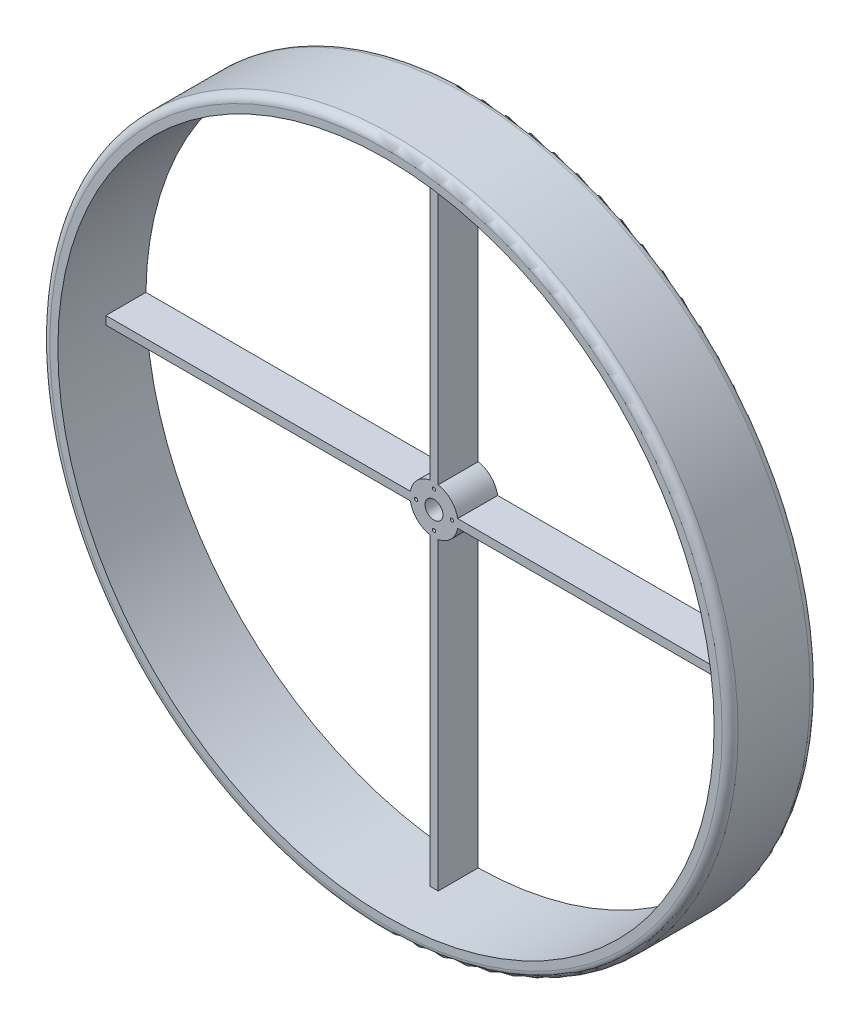
ISO-10303-21;
HEADER;
FILE_DESCRIPTION(('STEP AP214'),'2;1');
FILE_NAME('part.step','',(''),(''),'','','');
FILE_SCHEMA(('AUTOMOTIVE_DESIGN { 1 0 10303 214 1 1 1 1 }'));
ENDSEC;
DATA;
#1=APPLICATION_CONTEXT('core data for automotive mechanical design processes');
#2=APPLICATION_PROTOCOL_DEFINITION('international standard','automotive_design',2000,#1);
#3=PRODUCT_CONTEXT('',#1,'mechanical');
#4=PRODUCT('Part','Part','',(#3));
#5=PRODUCT_RELATED_PRODUCT_CATEGORY('part','',(#4));
#6=PRODUCT_DEFINITION_FORMATION('','',#4);
#7=PRODUCT_DEFINITION_CONTEXT('part definition',#1,'design');
#8=PRODUCT_DEFINITION('design','',#6,#7);
#9=PRODUCT_DEFINITION_SHAPE('','',#8);
#10=(LENGTH_UNIT() NAMED_UNIT(*) SI_UNIT(.MILLI.,.METRE.));
#11=(NAMED_UNIT(*) PLANE_ANGLE_UNIT() SI_UNIT($,.RADIAN.));
#12=(NAMED_UNIT(*) SI_UNIT($,.STERADIAN.) SOLID_ANGLE_UNIT());
#13=UNCERTAINTY_MEASURE_WITH_UNIT(LENGTH_MEASURE(1.E-05),#10,'distance_accuracy_value','');
#14=(GEOMETRIC_REPRESENTATION_CONTEXT(3) GLOBAL_UNCERTAINTY_ASSIGNED_CONTEXT((#13)) GLOBAL_UNIT_ASSIGNED_CONTEXT((#10,
#11,#12)) REPRESENTATION_CONTEXT('',''));
#15=CARTESIAN_POINT('',(0.,0.,0.));
#16=DIRECTION('',(0.,0.,1.));
#17=DIRECTION('',(1.,0.,0.));
#18=AXIS2_PLACEMENT_3D('',#15,#16,#17);
#19=CARTESIAN_POINT('',(0.,0.,-3.125));
#20=DIRECTION('',(0.,0.,1.));
#21=DIRECTION('',(1.,0.,0.));
#22=AXIS2_PLACEMENT_3D('',#19,#20,#21);
#23=CYLINDRICAL_SURFACE('',#22,128.125);
#24=CARTESIAN_POINT('',(0.,0.,31.25));
#25=DIRECTION('',(0.,0.,1.));
#26=DIRECTION('',(1.,0.,0.));
#27=AXIS2_PLACEMENT_3D('',#24,#25,#26);
#28=CIRCLE('',#27,128.125);
#29=CARTESIAN_POINT('',(128.125,0.,31.25));
#30=VERTEX_POINT('',#29);
#31=EDGE_CURVE('E290',#30,#30,#28,.T.);
#32=ORIENTED_EDGE('',*,*,#31,.T.);
#33=EDGE_LOOP('',(#32));
#34=FACE_BOUND('',#33,.T.);
#35=DIRECTION('',(0.,0.,1.));
#36=VECTOR('',#35,1.);
#37=CARTESIAN_POINT('',(1.62795166562606,-128.114657234738,-3.125));
#38=LINE('',#37,#36);
#39=CARTESIAN_POINT('',(1.62795166562606,-128.114657234738,12.5));
#40=VERTEX_POINT('',#39);
#41=CARTESIAN_POINT('',(1.62795166562606,-128.114657234738,-3.125));
#42=VERTEX_POINT('',#41);
#43=EDGE_CURVE('E347',#40,#42,#38,.F.);
#44=ORIENTED_EDGE('',*,*,#43,.F.);
#45=CARTESIAN_POINT('',(0.,0.,12.5));
#46=DIRECTION('',(0.,0.,1.));
#47=DIRECTION('',(1.,0.,0.));
#48=AXIS2_PLACEMENT_3D('',#45,#46,#47);
#49=CIRCLE('',#48,128.125);
#50=CARTESIAN_POINT('',(-1.62795166562874,-128.114657234738,12.5));
#51=VERTEX_POINT('',#50);
#52=EDGE_CURVE('E320',#40,#51,#49,.F.);
#53=ORIENTED_EDGE('',*,*,#52,.T.);
#54=DIRECTION('',(0.,0.,1.));
#55=VECTOR('',#54,1.);
#56=CARTESIAN_POINT('',(-1.62795166562874,-128.114657234738,-3.125));
#57=LINE('',#56,#55);
#58=CARTESIAN_POINT('',(-1.62795166562874,-128.114657234738,-3.125));
#59=VERTEX_POINT('',#58);
#60=EDGE_CURVE('E343',#51,#59,#57,.F.);
#61=ORIENTED_EDGE('',*,*,#60,.T.);
#62=CARTESIAN_POINT('',(0.,0.,-3.125));
#63=DIRECTION('',(0.,0.,1.));
#64=DIRECTION('',(1.,0.,0.));
#65=AXIS2_PLACEMENT_3D('',#62,#63,#64);
#66=CIRCLE('',#65,128.125);
#67=CARTESIAN_POINT('',(-128.114657234738,-1.62795166562741,-3.125));
#68=VERTEX_POINT('',#67);
#69=EDGE_CURVE('E657',#68,#59,#66,.T.);
#70=ORIENTED_EDGE('',*,*,#69,.F.);
#71=DIRECTION('',(0.,0.,1.));
#72=VECTOR('',#71,1.);
#73=CARTESIAN_POINT('',(-128.114657234738,-1.62795166562741,-3.125));
#74=LINE('',#73,#72);
#75=CARTESIAN_POINT('',(-128.114657234738,-1.62795166562741,12.5));
#76=VERTEX_POINT('',#75);
#77=EDGE_CURVE('E340',#76,#68,#74,.F.);
#78=ORIENTED_EDGE('',*,*,#77,.F.);
#79=CARTESIAN_POINT('',(-128.114657234738,1.62795166562741,12.5));
#80=VERTEX_POINT('',#79);
#81=EDGE_CURVE('E335',#76,#80,#49,.F.);
#82=ORIENTED_EDGE('',*,*,#81,.T.);
#83=DIRECTION('',(0.,0.,1.));
#84=VECTOR('',#83,1.);
#85=CARTESIAN_POINT('',(-128.114657234738,1.62795166562741,-3.125));
#86=LINE('',#85,#84);
#87=CARTESIAN_POINT('',(-128.114657234738,1.62795166562741,-3.125));
#88=VERTEX_POINT('',#87);
#89=EDGE_CURVE('E336',#80,#88,#86,.F.);
#90=ORIENTED_EDGE('',*,*,#89,.T.);
#91=CARTESIAN_POINT('',(-1.62795166562606,128.114657234738,-3.125));
#92=VERTEX_POINT('',#91);
#93=EDGE_CURVE('E316',#92,#88,#66,.T.);
#94=ORIENTED_EDGE('',*,*,#93,.F.);
#95=DIRECTION('',(0.,0.,1.));
#96=VECTOR('',#95,1.);
#97=CARTESIAN_POINT('',(-1.62795166562606,128.114657234738,-3.125));
#98=LINE('',#97,#96);
#99=CARTESIAN_POINT('',(-1.62795166562606,128.114657234738,12.5));
#100=VERTEX_POINT('',#99);
#101=EDGE_CURVE('E332',#100,#92,#98,.F.);
#102=ORIENTED_EDGE('',*,*,#101,.F.);
#103=CARTESIAN_POINT('',(1.62795166562876,128.114657234738,12.5));
#104=VERTEX_POINT('',#103);
#105=EDGE_CURVE('E321',#100,#104,#49,.F.);
#106=ORIENTED_EDGE('',*,*,#105,.T.);
#107=DIRECTION('',(0.,0.,1.));
#108=VECTOR('',#107,1.);
#109=CARTESIAN_POINT('',(1.62795166562876,128.114657234738,-3.125));
#110=LINE('',#109,#108);
#111=CARTESIAN_POINT('',(1.62795166562876,128.114657234738,-3.125));
#112=VERTEX_POINT('',#111);
#113=EDGE_CURVE('E328',#104,#112,#110,.F.);
#114=ORIENTED_EDGE('',*,*,#113,.T.);
#115=CARTESIAN_POINT('',(128.114657234738,1.62795166562741,-3.125));
#116=VERTEX_POINT('',#115);
#117=EDGE_CURVE('E312',#116,#112,#66,.T.);
#118=ORIENTED_EDGE('',*,*,#117,.F.);
#119=DIRECTION('',(0.,0.,1.));
#120=VECTOR('',#119,1.);
#121=CARTESIAN_POINT('',(128.114657234738,1.62795166562741,-3.125));
#122=LINE('',#121,#120);
#123=CARTESIAN_POINT('',(128.114657234738,1.62795166562741,12.5));
#124=VERTEX_POINT('',#123);
#125=EDGE_CURVE('E325',#124,#116,#122,.F.);
#126=ORIENTED_EDGE('',*,*,#125,.F.);
#127=CARTESIAN_POINT('',(128.114657234738,-1.62795166562741,12.5));
#128=VERTEX_POINT('',#127);
#129=EDGE_CURVE('E182',#124,#128,#49,.F.);
#130=ORIENTED_EDGE('',*,*,#129,.T.);
#131=DIRECTION('',(0.,0.,1.));
#132=VECTOR('',#131,1.);
#133=CARTESIAN_POINT('',(128.114657234738,-1.62795166562741,-3.125));
#134=LINE('',#133,#132);
#135=CARTESIAN_POINT('',(128.114657234738,-1.62795166562741,-3.125));
#136=VERTEX_POINT('',#135);
#137=EDGE_CURVE('E319',#128,#136,#134,.F.);
#138=ORIENTED_EDGE('',*,*,#137,.T.);
#139=EDGE_CURVE('E311',#42,#136,#66,.T.);
#140=ORIENTED_EDGE('',*,*,#139,.F.);
#141=EDGE_LOOP('',(#44,#53,#61,#70,#78,#82,#90,#94,#102,#106,#114,#118,#126,#130,#138,#140));
#142=FACE_BOUND('',#141,.T.);
#143=ADVANCED_FACE('F43',(#34,#142),#23,.F.);
#144=CARTESIAN_POINT('',(0.,0.,-3.125));
#145=DIRECTION('',(0.,0.,1.));
#146=DIRECTION('',(1.,0.,0.));
#147=AXIS2_PLACEMENT_3D('',#144,#145,#146);
#148=CYLINDRICAL_SURFACE('',#147,134.375);
#149=CARTESIAN_POINT('',(0.,0.,0.));
#150=DIRECTION('',(0.,0.,1.));
#151=DIRECTION('',(1.,0.,0.));
#152=AXIS2_PLACEMENT_3D('',#149,#150,#151);
#153=CIRCLE('',#152,134.375);
#154=CARTESIAN_POINT('',(134.375,0.,0.));
#155=VERTEX_POINT('',#154);
#156=EDGE_CURVE('E52',#155,#155,#153,.T.);
#157=ORIENTED_EDGE('',*,*,#156,.T.);
#158=EDGE_LOOP('',(#157));
#159=FACE_BOUND('',#158,.T.);
#160=CARTESIAN_POINT('',(0.,0.,28.125));
#161=DIRECTION('',(0.,0.,1.));
#162=DIRECTION('',(1.,0.,0.));
#163=AXIS2_PLACEMENT_3D('',#160,#161,#162);
#164=CIRCLE('',#163,134.375);
#165=CARTESIAN_POINT('',(134.375,0.,28.125));
#166=VERTEX_POINT('',#165);
#167=EDGE_CURVE('E354',#166,#166,#164,.F.);
#168=ORIENTED_EDGE('',*,*,#167,.T.);
#169=EDGE_LOOP('',(#168));
#170=FACE_BOUND('',#169,.T.);
#171=ADVANCED_FACE('F361',(#159,#170),#148,.T.);
#172=CARTESIAN_POINT('',(0.,0.,-3.125));
#173=DIRECTION('',(0.,0.,1.));
#174=DIRECTION('',(1.,0.,0.));
#175=AXIS2_PLACEMENT_3D('',#172,#173,#174);
#176=PLANE('',#175);
#177=CARTESIAN_POINT('',(0.,0.,-3.125));
#178=DIRECTION('',(0.,0.,1.));
#179=DIRECTION('',(1.,0.,0.));
#180=AXIS2_PLACEMENT_3D('',#177,#178,#179);
#181=CIRCLE('',#180,131.25);
#182=CARTESIAN_POINT('',(131.25,0.,-3.125));
#183=VERTEX_POINT('',#182);
#184=EDGE_CURVE('E11',#183,#183,#181,.F.);
#185=ORIENTED_EDGE('',*,*,#184,.T.);
#186=EDGE_LOOP('',(#185));
#187=FACE_BOUND('',#186,.T.);
#188=DIRECTION('',(1.,0.,0.));
#189=VECTOR('',#188,1.);
#190=CARTESIAN_POINT('',(0.,1.62795166562741,-3.125));
#191=LINE('',#190,#189);
#192=CARTESIAN_POINT('',(9.23257268448946,1.62795166562741,-3.125));
#193=VERTEX_POINT('',#192);
#194=EDGE_CURVE('E165',#193,#116,#191,.T.);
#195=ORIENTED_EDGE('',*,*,#194,.T.);
#196=ORIENTED_EDGE('',*,*,#117,.T.);
#197=DIRECTION('',(0.,1.,0.));
#198=VECTOR('',#197,1.);
#199=CARTESIAN_POINT('',(1.62795166562741,0.,-3.125));
#200=LINE('',#199,#198);
#201=CARTESIAN_POINT('',(1.6279516656275,9.23257268448945,-3.125));
#202=VERTEX_POINT('',#201);
#203=EDGE_CURVE('E248',#202,#112,#200,.T.);
#204=ORIENTED_EDGE('',*,*,#203,.F.);
#205=CARTESIAN_POINT('',(0.,0.,-3.125));
#206=DIRECTION('',(0.,0.,1.));
#207=DIRECTION('',(1.,0.,0.));
#208=AXIS2_PLACEMENT_3D('',#205,#206,#207);
#209=CIRCLE('',#208,9.375);
#210=EDGE_CURVE('E245',#193,#202,#209,.T.);
#211=ORIENTED_EDGE('',*,*,#210,.F.);
#212=EDGE_LOOP('',(#195,#196,#204,#211));
#213=FACE_BOUND('',#212,.T.);
#214=DIRECTION('',(0.,-1.,0.));
#215=VECTOR('',#214,1.);
#216=CARTESIAN_POINT('',(1.62795166562741,0.,-3.125));
#217=LINE('',#216,#215);
#218=CARTESIAN_POINT('',(1.62795166562731,-9.23257268448948,-3.125));
#219=VERTEX_POINT('',#218);
#220=EDGE_CURVE('E273',#219,#42,#217,.T.);
#221=ORIENTED_EDGE('',*,*,#220,.T.);
#222=ORIENTED_EDGE('',*,*,#139,.T.);
#223=DIRECTION('',(1.,0.,0.));
#224=VECTOR('',#223,1.);
#225=CARTESIAN_POINT('',(0.,-1.62795166562741,-3.125));
#226=LINE('',#225,#224);
#227=CARTESIAN_POINT('',(9.23257268448946,-1.62795166562741,-3.125));
#228=VERTEX_POINT('',#227);
#229=EDGE_CURVE('E281',#228,#136,#226,.T.);
#230=ORIENTED_EDGE('',*,*,#229,.F.);
#231=CARTESIAN_POINT('',(0.,0.,-3.125));
#232=DIRECTION('',(0.,0.,1.));
#233=DIRECTION('',(1.,0.,0.));
#234=AXIS2_PLACEMENT_3D('',#231,#232,#233);
#235=CIRCLE('',#234,9.375);
#236=EDGE_CURVE('E277',#219,#228,#235,.T.);
#237=ORIENTED_EDGE('',*,*,#236,.F.);
#238=EDGE_LOOP('',(#221,#222,#230,#237));
#239=FACE_BOUND('',#238,.T.);
#240=DIRECTION('',(-1.,0.,0.));
#241=VECTOR('',#240,1.);
#242=CARTESIAN_POINT('',(0.,-1.62795166562741,-3.125));
#243=LINE('',#242,#241);
#244=CARTESIAN_POINT('',(-9.23257268448946,-1.62795166562741,-3.125));
#245=VERTEX_POINT('',#244);
#246=EDGE_CURVE('E262',#245,#68,#243,.T.);
#247=ORIENTED_EDGE('',*,*,#246,.T.);
#248=ORIENTED_EDGE('',*,*,#69,.T.);
#249=DIRECTION('',(0.,-1.,0.));
#250=VECTOR('',#249,1.);
#251=CARTESIAN_POINT('',(-1.62795166562741,0.,-3.125));
#252=LINE('',#251,#250);
#253=CARTESIAN_POINT('',(-1.6279516656275,-9.23257268448945,-3.125));
#254=VERTEX_POINT('',#253);
#255=EDGE_CURVE('E270',#254,#59,#252,.T.);
#256=ORIENTED_EDGE('',*,*,#255,.F.);
#257=CARTESIAN_POINT('',(0.,0.,-3.125));
#258=DIRECTION('',(0.,0.,1.));
#259=DIRECTION('',(1.,0.,0.));
#260=AXIS2_PLACEMENT_3D('',#257,#258,#259);
#261=CIRCLE('',#260,9.375);
#262=EDGE_CURVE('E266',#245,#254,#261,.T.);
#263=ORIENTED_EDGE('',*,*,#262,.F.);
#264=EDGE_LOOP('',(#247,#248,#256,#263));
#265=FACE_BOUND('',#264,.T.);
#266=DIRECTION('',(0.,1.,0.));
#267=VECTOR('',#266,1.);
#268=CARTESIAN_POINT('',(-1.62795166562741,0.,-3.125));
#269=LINE('',#268,#267);
#270=CARTESIAN_POINT('',(-1.62795166562731,9.23257268448948,-3.125));
#271=VERTEX_POINT('',#270);
#272=EDGE_CURVE('E251',#271,#92,#269,.T.);
#273=ORIENTED_EDGE('',*,*,#272,.T.);
#274=ORIENTED_EDGE('',*,*,#93,.T.);
#275=DIRECTION('',(-1.,0.,0.));
#276=VECTOR('',#275,1.);
#277=CARTESIAN_POINT('',(0.,1.62795166562741,-3.125));
#278=LINE('',#277,#276);
#279=CARTESIAN_POINT('',(-9.23257268448946,1.62795166562741,-3.125));
#280=VERTEX_POINT('',#279);
#281=EDGE_CURVE('E259',#280,#88,#278,.T.);
#282=ORIENTED_EDGE('',*,*,#281,.F.);
#283=CARTESIAN_POINT('',(0.,0.,-3.125));
#284=DIRECTION('',(0.,0.,1.));
#285=DIRECTION('',(1.,0.,0.));
#286=AXIS2_PLACEMENT_3D('',#283,#284,#285);
#287=CIRCLE('',#286,9.375);
#288=EDGE_CURVE('E255',#271,#280,#287,.T.);
#289=ORIENTED_EDGE('',*,*,#288,.F.);
#290=EDGE_LOOP('',(#273,#274,#282,#289));
#291=FACE_BOUND('',#290,.T.);
#292=CARTESIAN_POINT('',(0.,6.99999999999998,-3.125));
#293=DIRECTION('',(0.,0.,1.));
#294=DIRECTION('',(1.,0.,0.));
#295=AXIS2_PLACEMENT_3D('',#292,#293,#294);
#296=CIRCLE('',#295,0.624999999999999);
#297=CARTESIAN_POINT('',(0.625000000000073,6.99999999999998,-3.125));
#298=VERTEX_POINT('',#297);
#299=EDGE_CURVE('E227',#298,#298,#296,.T.);
#300=ORIENTED_EDGE('',*,*,#299,.T.);
#301=EDGE_LOOP('',(#300));
#302=FACE_BOUND('',#301,.T.);
#303=CARTESIAN_POINT('',(-6.99999999999998,0.,-3.125));
#304=DIRECTION('',(0.,0.,1.));
#305=DIRECTION('',(1.,0.,0.));
#306=AXIS2_PLACEMENT_3D('',#303,#304,#305);
#307=CIRCLE('',#306,0.625);
#308=CARTESIAN_POINT('',(-6.37499999999998,0.,-3.125));
#309=VERTEX_POINT('',#308);
#310=EDGE_CURVE('E231',#309,#309,#307,.F.);
#311=ORIENTED_EDGE('',*,*,#310,.F.);
#312=EDGE_LOOP('',(#311));
#313=FACE_BOUND('',#312,.T.);
#314=CARTESIAN_POINT('',(7.,0.,-3.125));
#315=DIRECTION('',(0.,0.,1.));
#316=DIRECTION('',(1.,0.,0.));
#317=AXIS2_PLACEMENT_3D('',#314,#315,#316);
#318=CIRCLE('',#317,0.625);
#319=CARTESIAN_POINT('',(7.625,0.,-3.125));
#320=VERTEX_POINT('',#319);
#321=EDGE_CURVE('E235',#320,#320,#318,.T.);
#322=ORIENTED_EDGE('',*,*,#321,.T.);
#323=EDGE_LOOP('',(#322));
#324=FACE_BOUND('',#323,.T.);
#325=CARTESIAN_POINT('',(0.,0.,-3.125));
#326=DIRECTION('',(0.,0.,1.));
#327=DIRECTION('',(1.,0.,0.));
#328=AXIS2_PLACEMENT_3D('',#325,#326,#327);
#329=CIRCLE('',#328,3.5);
#330=CARTESIAN_POINT('',(3.5,0.,-3.125));
#331=VERTEX_POINT('',#330);
#332=EDGE_CURVE('E239',#331,#331,#329,.T.);
#333=ORIENTED_EDGE('',*,*,#332,.T.);
#334=EDGE_LOOP('',(#333));
#335=FACE_BOUND('',#334,.T.);
#336=CARTESIAN_POINT('',(0.,-7.,-3.125));
#337=DIRECTION('',(0.,0.,1.));
#338=DIRECTION('',(1.,0.,0.));
#339=AXIS2_PLACEMENT_3D('',#336,#337,#338);
#340=CIRCLE('',#339,0.625);
#341=CARTESIAN_POINT('',(0.624999999999929,-7.,-3.125));
#342=VERTEX_POINT('',#341);
#343=EDGE_CURVE('E171',#342,#342,#340,.F.);
#344=ORIENTED_EDGE('',*,*,#343,.F.);
#345=EDGE_LOOP('',(#344));
#346=FACE_BOUND('',#345,.T.);
#347=ADVANCED_FACE('F379',(#187,#213,#239,#265,#291,#302,#313,#324,#335,#346),#176,.F.);
#348=CARTESIAN_POINT('',(0.,0.,31.25));
#349=DIRECTION('',(0.,0.,1.));
#350=DIRECTION('',(1.,0.,0.));
#351=AXIS2_PLACEMENT_3D('',#348,#349,#350);
#352=PLANE('',#351);
#353=CARTESIAN_POINT('',(0.,0.,31.25));
#354=DIRECTION('',(0.,0.,1.));
#355=DIRECTION('',(1.,0.,0.));
#356=AXIS2_PLACEMENT_3D('',#353,#354,#355);
#357=CIRCLE('',#356,131.25);
#358=CARTESIAN_POINT('',(131.25,0.,31.25));
#359=VERTEX_POINT('',#358);
#360=EDGE_CURVE('E350',#359,#359,#357,.T.);
#361=ORIENTED_EDGE('',*,*,#360,.T.);
#362=EDGE_LOOP('',(#361));
#363=FACE_BOUND('',#362,.T.);
#364=ORIENTED_EDGE('',*,*,#31,.F.);
#365=EDGE_LOOP('',(#364));
#366=FACE_BOUND('',#365,.T.);
#367=ADVANCED_FACE('F384',(#363,#366),#352,.T.);
#368=CARTESIAN_POINT('',(0.,1.62795166562741,-3.125));
#369=DIRECTION('',(0.,-1.,0.));
#370=DIRECTION('',(0.,0.,-1.));
#371=AXIS2_PLACEMENT_3D('',#368,#369,#370);
#372=PLANE('',#371);
#373=DIRECTION('',(1.,0.,0.));
#374=VECTOR('',#373,1.);
#375=CARTESIAN_POINT('',(0.,1.62795166562741,12.5));
#376=LINE('',#375,#374);
#377=CARTESIAN_POINT('',(9.23257268448946,1.62795166562741,12.5));
#378=VERTEX_POINT('',#377);
#379=EDGE_CURVE('E162',#378,#124,#376,.T.);
#380=ORIENTED_EDGE('',*,*,#379,.T.);
#381=ORIENTED_EDGE('',*,*,#125,.T.);
#382=ORIENTED_EDGE('',*,*,#194,.F.);
#383=DIRECTION('',(0.,0.,1.));
#384=VECTOR('',#383,1.);
#385=CARTESIAN_POINT('',(9.23257268448946,1.62795166562741,-3.125));
#386=LINE('',#385,#384);
#387=EDGE_CURVE('E158',#193,#378,#386,.T.);
#388=ORIENTED_EDGE('',*,*,#387,.T.);
#389=EDGE_LOOP('',(#380,#381,#382,#388));
#390=FACE_BOUND('',#389,.T.);
#391=ADVANCED_FACE('F160',(#390),#372,.F.);
#392=CARTESIAN_POINT('',(0.,-1.62795166562741,-3.125));
#393=DIRECTION('',(0.,-1.,0.));
#394=DIRECTION('',(0.,0.,-1.));
#395=AXIS2_PLACEMENT_3D('',#392,#393,#394);
#396=PLANE('',#395);
#397=ORIENTED_EDGE('',*,*,#137,.F.);
#398=DIRECTION('',(1.,0.,0.));
#399=VECTOR('',#398,1.);
#400=CARTESIAN_POINT('',(0.,-1.62795166562741,12.5));
#401=LINE('',#400,#399);
#402=CARTESIAN_POINT('',(9.23257268448946,-1.62795166562741,12.5));
#403=VERTEX_POINT('',#402);
#404=EDGE_CURVE('E220',#403,#128,#401,.T.);
#405=ORIENTED_EDGE('',*,*,#404,.F.);
#406=DIRECTION('',(0.,0.,1.));
#407=VECTOR('',#406,1.);
#408=CARTESIAN_POINT('',(9.23257268448946,-1.62795166562741,-3.125));
#409=LINE('',#408,#407);
#410=EDGE_CURVE('E287',#228,#403,#409,.T.);
#411=ORIENTED_EDGE('',*,*,#410,.F.);
#412=ORIENTED_EDGE('',*,*,#229,.T.);
#413=EDGE_LOOP('',(#397,#405,#411,#412));
#414=FACE_BOUND('',#413,.T.);
#415=ADVANCED_FACE('F444',(#414),#396,.T.);
#416=CARTESIAN_POINT('',(1.62795166562741,0.,-3.125));
#417=DIRECTION('',(-1.,0.,0.));
#418=DIRECTION('',(0.,-1.,0.));
#419=AXIS2_PLACEMENT_3D('',#416,#417,#418);
#420=PLANE('',#419);
#421=DIRECTION('',(0.,-1.,0.));
#422=VECTOR('',#421,1.);
#423=CARTESIAN_POINT('',(1.62795166562741,0.,12.5));
#424=LINE('',#423,#422);
#425=CARTESIAN_POINT('',(1.62795166562731,-9.23257268448948,12.5));
#426=VERTEX_POINT('',#425);
#427=EDGE_CURVE('E212',#426,#40,#424,.T.);
#428=ORIENTED_EDGE('',*,*,#427,.T.);
#429=ORIENTED_EDGE('',*,*,#43,.T.);
#430=ORIENTED_EDGE('',*,*,#220,.F.);
#431=DIRECTION('',(0.,0.,1.));
#432=VECTOR('',#431,1.);
#433=CARTESIAN_POINT('',(1.62795166562731,-9.23257268448948,-3.125));
#434=LINE('',#433,#432);
#435=EDGE_CURVE('E291',#219,#426,#434,.T.);
#436=ORIENTED_EDGE('',*,*,#435,.T.);
#437=EDGE_LOOP('',(#428,#429,#430,#436));
#438=FACE_BOUND('',#437,.T.);
#439=ADVANCED_FACE('F446',(#438),#420,.F.);
#440=CARTESIAN_POINT('',(-1.62795166562741,0.,-3.125));
#441=DIRECTION('',(-1.,0.,0.));
#442=DIRECTION('',(0.,-1.,0.));
#443=AXIS2_PLACEMENT_3D('',#440,#441,#442);
#444=PLANE('',#443);
#445=ORIENTED_EDGE('',*,*,#60,.F.);
#446=DIRECTION('',(0.,-1.,0.));
#447=VECTOR('',#446,1.);
#448=CARTESIAN_POINT('',(-1.62795166562741,0.,12.5));
#449=LINE('',#448,#447);
#450=CARTESIAN_POINT('',(-1.6279516656275,-9.23257268448945,12.5));
#451=VERTEX_POINT('',#450);
#452=EDGE_CURVE('E59',#451,#51,#449,.T.);
#453=ORIENTED_EDGE('',*,*,#452,.F.);
#454=DIRECTION('',(0.,0.,1.));
#455=VECTOR('',#454,1.);
#456=CARTESIAN_POINT('',(-1.6279516656275,-9.23257268448945,-3.125));
#457=LINE('',#456,#455);
#458=EDGE_CURVE('E294',#254,#451,#457,.T.);
#459=ORIENTED_EDGE('',*,*,#458,.F.);
#460=ORIENTED_EDGE('',*,*,#255,.T.);
#461=EDGE_LOOP('',(#445,#453,#459,#460));
#462=FACE_BOUND('',#461,.T.);
#463=ADVANCED_FACE('F451',(#462),#444,.T.);
#464=CARTESIAN_POINT('',(0.,-1.62795166562741,-3.125));
#465=DIRECTION('',(0.,1.,0.));
#466=DIRECTION('',(0.,0.,1.));
#467=AXIS2_PLACEMENT_3D('',#464,#465,#466);
#468=PLANE('',#467);
#469=DIRECTION('',(-1.,0.,0.));
#470=VECTOR('',#469,1.);
#471=CARTESIAN_POINT('',(0.,-1.62795166562741,12.5));
#472=LINE('',#471,#470);
#473=CARTESIAN_POINT('',(-9.23257268448946,-1.62795166562741,12.5));
#474=VERTEX_POINT('',#473);
#475=EDGE_CURVE('E203',#474,#76,#472,.T.);
#476=ORIENTED_EDGE('',*,*,#475,.T.);
#477=ORIENTED_EDGE('',*,*,#77,.T.);
#478=ORIENTED_EDGE('',*,*,#246,.F.);
#479=DIRECTION('',(0.,0.,1.));
#480=VECTOR('',#479,1.);
#481=CARTESIAN_POINT('',(-9.23257268448946,-1.62795166562741,-3.125));
#482=LINE('',#481,#480);
#483=EDGE_CURVE('E297',#245,#474,#482,.T.);
#484=ORIENTED_EDGE('',*,*,#483,.T.);
#485=EDGE_LOOP('',(#476,#477,#478,#484));
#486=FACE_BOUND('',#485,.T.);
#487=ADVANCED_FACE('F455',(#486),#468,.F.);
#488=CARTESIAN_POINT('',(0.,1.62795166562741,-3.125));
#489=DIRECTION('',(0.,1.,0.));
#490=DIRECTION('',(0.,0.,1.));
#491=AXIS2_PLACEMENT_3D('',#488,#489,#490);
#492=PLANE('',#491);
#493=ORIENTED_EDGE('',*,*,#89,.F.);
#494=DIRECTION('',(-1.,0.,0.));
#495=VECTOR('',#494,1.);
#496=CARTESIAN_POINT('',(0.,1.62795166562741,12.5));
#497=LINE('',#496,#495);
#498=CARTESIAN_POINT('',(-9.23257268448946,1.62795166562741,12.5));
#499=VERTEX_POINT('',#498);
#500=EDGE_CURVE('E66',#499,#80,#497,.T.);
#501=ORIENTED_EDGE('',*,*,#500,.F.);
#502=DIRECTION('',(0.,0.,1.));
#503=VECTOR('',#502,1.);
#504=CARTESIAN_POINT('',(-9.23257268448946,1.62795166562741,-3.125));
#505=LINE('',#504,#503);
#506=EDGE_CURVE('E300',#280,#499,#505,.T.);
#507=ORIENTED_EDGE('',*,*,#506,.F.);
#508=ORIENTED_EDGE('',*,*,#281,.T.);
#509=EDGE_LOOP('',(#493,#501,#507,#508));
#510=FACE_BOUND('',#509,.T.);
#511=ADVANCED_FACE('F463',(#510),#492,.T.);
#512=CARTESIAN_POINT('',(-1.62795166562741,0.,-3.125));
#513=DIRECTION('',(1.,0.,0.));
#514=DIRECTION('',(0.,1.,0.));
#515=AXIS2_PLACEMENT_3D('',#512,#513,#514);
#516=PLANE('',#515);
#517=DIRECTION('',(0.,1.,0.));
#518=VECTOR('',#517,1.);
#519=CARTESIAN_POINT('',(-1.62795166562741,0.,12.5));
#520=LINE('',#519,#518);
#521=CARTESIAN_POINT('',(-1.62795166562731,9.23257268448948,12.5));
#522=VERTEX_POINT('',#521);
#523=EDGE_CURVE('E194',#522,#100,#520,.T.);
#524=ORIENTED_EDGE('',*,*,#523,.T.);
#525=ORIENTED_EDGE('',*,*,#101,.T.);
#526=ORIENTED_EDGE('',*,*,#272,.F.);
#527=DIRECTION('',(0.,0.,1.));
#528=VECTOR('',#527,1.);
#529=CARTESIAN_POINT('',(-1.62795166562731,9.23257268448948,-3.125));
#530=LINE('',#529,#528);
#531=EDGE_CURVE('E303',#271,#522,#530,.T.);
#532=ORIENTED_EDGE('',*,*,#531,.T.);
#533=EDGE_LOOP('',(#524,#525,#526,#532));
#534=FACE_BOUND('',#533,.T.);
#535=ADVANCED_FACE('F438',(#534),#516,.F.);
#536=CARTESIAN_POINT('',(1.62795166562741,0.,-3.125));
#537=DIRECTION('',(1.,0.,0.));
#538=DIRECTION('',(0.,1.,0.));
#539=AXIS2_PLACEMENT_3D('',#536,#537,#538);
#540=PLANE('',#539);
#541=ORIENTED_EDGE('',*,*,#113,.F.);
#542=DIRECTION('',(0.,1.,0.));
#543=VECTOR('',#542,1.);
#544=CARTESIAN_POINT('',(1.62795166562741,0.,12.5));
#545=LINE('',#544,#543);
#546=CARTESIAN_POINT('',(1.6279516656275,9.23257268448945,12.5));
#547=VERTEX_POINT('',#546);
#548=EDGE_CURVE('E178',#547,#104,#545,.T.);
#549=ORIENTED_EDGE('',*,*,#548,.F.);
#550=DIRECTION('',(0.,0.,1.));
#551=VECTOR('',#550,1.);
#552=CARTESIAN_POINT('',(1.6279516656275,9.23257268448945,-3.125));
#553=LINE('',#552,#551);
#554=EDGE_CURVE('E170',#202,#547,#553,.T.);
#555=ORIENTED_EDGE('',*,*,#554,.F.);
#556=ORIENTED_EDGE('',*,*,#203,.T.);
#557=EDGE_LOOP('',(#541,#549,#555,#556));
#558=FACE_BOUND('',#557,.T.);
#559=ADVANCED_FACE('F428',(#558),#540,.T.);
#560=CARTESIAN_POINT('',(0.,0.,12.5));
#561=DIRECTION('',(0.,0.,1.));
#562=DIRECTION('',(1.,0.,0.));
#563=AXIS2_PLACEMENT_3D('',#560,#561,#562);
#564=PLANE('',#563);
#565=CARTESIAN_POINT('',(0.,6.99999999999998,12.5));
#566=DIRECTION('',(0.,0.,1.));
#567=DIRECTION('',(1.,0.,0.));
#568=AXIS2_PLACEMENT_3D('',#565,#566,#567);
#569=CIRCLE('',#568,0.624999999999999);
#570=CARTESIAN_POINT('',(0.625000000000073,6.99999999999998,12.5));
#571=VERTEX_POINT('',#570);
#572=EDGE_CURVE('E495',#571,#571,#569,.T.);
#573=ORIENTED_EDGE('',*,*,#572,.F.);
#574=EDGE_LOOP('',(#573));
#575=FACE_BOUND('',#574,.T.);
#576=CARTESIAN_POINT('',(-6.99999999999998,0.,12.5));
#577=DIRECTION('',(0.,0.,1.));
#578=DIRECTION('',(1.,0.,0.));
#579=AXIS2_PLACEMENT_3D('',#576,#577,#578);
#580=CIRCLE('',#579,0.625);
#581=CARTESIAN_POINT('',(-6.37499999999998,0.,12.5));
#582=VERTEX_POINT('',#581);
#583=EDGE_CURVE('E497',#582,#582,#580,.F.);
#584=ORIENTED_EDGE('',*,*,#583,.T.);
#585=EDGE_LOOP('',(#584));
#586=FACE_BOUND('',#585,.T.);
#587=CARTESIAN_POINT('',(7.,0.,12.5));
#588=DIRECTION('',(0.,0.,1.));
#589=DIRECTION('',(1.,0.,0.));
#590=AXIS2_PLACEMENT_3D('',#587,#588,#589);
#591=CIRCLE('',#590,0.625);
#592=CARTESIAN_POINT('',(7.625,0.,12.5));
#593=VERTEX_POINT('',#592);
#594=EDGE_CURVE('E188',#593,#593,#591,.T.);
#595=ORIENTED_EDGE('',*,*,#594,.F.);
#596=EDGE_LOOP('',(#595));
#597=FACE_BOUND('',#596,.T.);
#598=CARTESIAN_POINT('',(0.,0.,12.5));
#599=DIRECTION('',(0.,0.,1.));
#600=DIRECTION('',(1.,0.,0.));
#601=AXIS2_PLACEMENT_3D('',#598,#599,#600);
#602=CIRCLE('',#601,3.5);
#603=CARTESIAN_POINT('',(3.5,0.,12.5));
#604=VERTEX_POINT('',#603);
#605=EDGE_CURVE('E184',#604,#604,#602,.T.);
#606=ORIENTED_EDGE('',*,*,#605,.F.);
#607=EDGE_LOOP('',(#606));
#608=FACE_BOUND('',#607,.T.);
#609=CARTESIAN_POINT('',(0.,-7.,12.5));
#610=DIRECTION('',(0.,0.,1.));
#611=DIRECTION('',(1.,0.,0.));
#612=AXIS2_PLACEMENT_3D('',#609,#610,#611);
#613=CIRCLE('',#612,0.625);
#614=CARTESIAN_POINT('',(0.624999999999929,-7.,12.5));
#615=VERTEX_POINT('',#614);
#616=EDGE_CURVE('E223',#615,#615,#613,.F.);
#617=ORIENTED_EDGE('',*,*,#616,.T.);
#618=EDGE_LOOP('',(#617));
#619=FACE_BOUND('',#618,.T.);
#620=ORIENTED_EDGE('',*,*,#52,.F.);
#621=ORIENTED_EDGE('',*,*,#427,.F.);
#622=CARTESIAN_POINT('',(0.,0.,12.5));
#623=DIRECTION('',(0.,0.,1.));
#624=DIRECTION('',(1.,0.,0.));
#625=AXIS2_PLACEMENT_3D('',#622,#623,#624);
#626=CIRCLE('',#625,9.375);
#627=EDGE_CURVE('E216',#426,#403,#626,.T.);
#628=ORIENTED_EDGE('',*,*,#627,.T.);
#629=ORIENTED_EDGE('',*,*,#404,.T.);
#630=ORIENTED_EDGE('',*,*,#129,.F.);
#631=ORIENTED_EDGE('',*,*,#379,.F.);
#632=CARTESIAN_POINT('',(0.,0.,12.5));
#633=DIRECTION('',(0.,0.,1.));
#634=DIRECTION('',(1.,0.,0.));
#635=AXIS2_PLACEMENT_3D('',#632,#633,#634);
#636=CIRCLE('',#635,9.375);
#637=EDGE_CURVE('E174',#378,#547,#636,.T.);
#638=ORIENTED_EDGE('',*,*,#637,.T.);
#639=ORIENTED_EDGE('',*,*,#548,.T.);
#640=ORIENTED_EDGE('',*,*,#105,.F.);
#641=ORIENTED_EDGE('',*,*,#523,.F.);
#642=CARTESIAN_POINT('',(0.,0.,12.5));
#643=DIRECTION('',(0.,0.,1.));
#644=DIRECTION('',(1.,0.,0.));
#645=AXIS2_PLACEMENT_3D('',#642,#643,#644);
#646=CIRCLE('',#645,9.375);
#647=EDGE_CURVE('E198',#522,#499,#646,.T.);
#648=ORIENTED_EDGE('',*,*,#647,.T.);
#649=ORIENTED_EDGE('',*,*,#500,.T.);
#650=ORIENTED_EDGE('',*,*,#81,.F.);
#651=ORIENTED_EDGE('',*,*,#475,.F.);
#652=CARTESIAN_POINT('',(0.,0.,12.5));
#653=DIRECTION('',(0.,0.,1.));
#654=DIRECTION('',(1.,0.,0.));
#655=AXIS2_PLACEMENT_3D('',#652,#653,#654);
#656=CIRCLE('',#655,9.375);
#657=EDGE_CURVE('E207',#474,#451,#656,.T.);
#658=ORIENTED_EDGE('',*,*,#657,.T.);
#659=ORIENTED_EDGE('',*,*,#452,.T.);
#660=EDGE_LOOP('',(#620,#621,#628,#629,#630,#631,#638,#639,#640,#641,#648,#649,#650,#651,#658,#659));
#661=FACE_BOUND('',#660,.T.);
#662=ADVANCED_FACE('F180',(#575,#586,#597,#608,#619,#661),#564,.T.);
#663=CARTESIAN_POINT('',(0.,0.,-3.125));
#664=DIRECTION('',(0.,0.,1.));
#665=DIRECTION('',(1.,0.,0.));
#666=AXIS2_PLACEMENT_3D('',#663,#664,#665);
#667=CYLINDRICAL_SURFACE('',#666,9.375);
#668=ORIENTED_EDGE('',*,*,#410,.T.);
#669=ORIENTED_EDGE('',*,*,#627,.F.);
#670=ORIENTED_EDGE('',*,*,#435,.F.);
#671=ORIENTED_EDGE('',*,*,#236,.T.);
#672=EDGE_LOOP('',(#668,#669,#670,#671));
#673=FACE_BOUND('',#672,.T.);
#674=ADVANCED_FACE('F427',(#673),#667,.T.);
#675=CARTESIAN_POINT('',(0.,0.,-3.125));
#676=DIRECTION('',(0.,0.,1.));
#677=DIRECTION('',(1.,0.,0.));
#678=AXIS2_PLACEMENT_3D('',#675,#676,#677);
#679=CYLINDRICAL_SURFACE('',#678,9.375);
#680=ORIENTED_EDGE('',*,*,#458,.T.);
#681=ORIENTED_EDGE('',*,*,#657,.F.);
#682=ORIENTED_EDGE('',*,*,#483,.F.);
#683=ORIENTED_EDGE('',*,*,#262,.T.);
#684=EDGE_LOOP('',(#680,#681,#682,#683));
#685=FACE_BOUND('',#684,.T.);
#686=ADVANCED_FACE('F435',(#685),#679,.T.);
#687=CARTESIAN_POINT('',(0.,0.,-3.125));
#688=DIRECTION('',(0.,0.,1.));
#689=DIRECTION('',(1.,0.,0.));
#690=AXIS2_PLACEMENT_3D('',#687,#688,#689);
#691=CYLINDRICAL_SURFACE('',#690,9.375);
#692=ORIENTED_EDGE('',*,*,#506,.T.);
#693=ORIENTED_EDGE('',*,*,#647,.F.);
#694=ORIENTED_EDGE('',*,*,#531,.F.);
#695=ORIENTED_EDGE('',*,*,#288,.T.);
#696=EDGE_LOOP('',(#692,#693,#694,#695));
#697=FACE_BOUND('',#696,.T.);
#698=ADVANCED_FACE('F459',(#697),#691,.T.);
#699=CARTESIAN_POINT('',(0.,0.,-3.125));
#700=DIRECTION('',(0.,0.,1.));
#701=DIRECTION('',(1.,0.,0.));
#702=AXIS2_PLACEMENT_3D('',#699,#700,#701);
#703=CYLINDRICAL_SURFACE('',#702,9.375);
#704=ORIENTED_EDGE('',*,*,#554,.T.);
#705=ORIENTED_EDGE('',*,*,#637,.F.);
#706=ORIENTED_EDGE('',*,*,#387,.F.);
#707=ORIENTED_EDGE('',*,*,#210,.T.);
#708=EDGE_LOOP('',(#704,#705,#706,#707));
#709=FACE_BOUND('',#708,.T.);
#710=ADVANCED_FACE('F175',(#709),#703,.T.);
#711=CARTESIAN_POINT('',(0.,0.,-3.125));
#712=DIRECTION('',(0.,0.,1.));
#713=DIRECTION('',(1.,0.,0.));
#714=AXIS2_PLACEMENT_3D('',#711,#712,#713);
#715=CYLINDRICAL_SURFACE('',#714,3.5);
#716=ORIENTED_EDGE('',*,*,#332,.F.);
#717=EDGE_LOOP('',(#716));
#718=FACE_BOUND('',#717,.T.);
#719=ORIENTED_EDGE('',*,*,#605,.T.);
#720=EDGE_LOOP('',(#719));
#721=FACE_BOUND('',#720,.T.);
#722=ADVANCED_FACE('F476',(#718,#721),#715,.F.);
#723=CARTESIAN_POINT('',(7.,0.,-3.125));
#724=DIRECTION('',(0.,0.,1.));
#725=DIRECTION('',(1.,0.,0.));
#726=AXIS2_PLACEMENT_3D('',#723,#724,#725);
#727=CYLINDRICAL_SURFACE('',#726,0.625);
#728=ORIENTED_EDGE('',*,*,#321,.F.);
#729=EDGE_LOOP('',(#728));
#730=FACE_BOUND('',#729,.T.);
#731=ORIENTED_EDGE('',*,*,#594,.T.);
#732=EDGE_LOOP('',(#731));
#733=FACE_BOUND('',#732,.T.);
#734=ADVANCED_FACE('F481',(#730,#733),#727,.F.);
#735=CARTESIAN_POINT('',(-6.99999999999998,0.,-3.125));
#736=DIRECTION('',(0.,0.,1.));
#737=DIRECTION('',(1.,0.,0.));
#738=AXIS2_PLACEMENT_3D('',#735,#736,#737);
#739=CYLINDRICAL_SURFACE('',#738,0.625);
#740=ORIENTED_EDGE('',*,*,#310,.T.);
#741=EDGE_LOOP('',(#740));
#742=FACE_BOUND('',#741,.T.);
#743=ORIENTED_EDGE('',*,*,#583,.F.);
#744=EDGE_LOOP('',(#743));
#745=FACE_BOUND('',#744,.T.);
#746=ADVANCED_FACE('F485',(#742,#745),#739,.F.);
#747=CARTESIAN_POINT('',(0.,6.99999999999998,-3.125));
#748=DIRECTION('',(0.,0.,1.));
#749=DIRECTION('',(1.,0.,0.));
#750=AXIS2_PLACEMENT_3D('',#747,#748,#749);
#751=CYLINDRICAL_SURFACE('',#750,0.624999999999999);
#752=ORIENTED_EDGE('',*,*,#299,.F.);
#753=EDGE_LOOP('',(#752));
#754=FACE_BOUND('',#753,.T.);
#755=ORIENTED_EDGE('',*,*,#572,.T.);
#756=EDGE_LOOP('',(#755));
#757=FACE_BOUND('',#756,.T.);
#758=ADVANCED_FACE('F422',(#754,#757),#751,.F.);
#759=CARTESIAN_POINT('',(0.,-7.,-3.125));
#760=DIRECTION('',(0.,0.,1.));
#761=DIRECTION('',(1.,0.,0.));
#762=AXIS2_PLACEMENT_3D('',#759,#760,#761);
#763=CYLINDRICAL_SURFACE('',#762,0.625);
#764=ORIENTED_EDGE('',*,*,#343,.T.);
#765=EDGE_LOOP('',(#764));
#766=FACE_BOUND('',#765,.T.);
#767=ORIENTED_EDGE('',*,*,#616,.F.);
#768=EDGE_LOOP('',(#767));
#769=FACE_BOUND('',#768,.T.);
#770=ADVANCED_FACE('F370',(#766,#769),#763,.F.);
#771=CARTESIAN_POINT('',(0.,0.,28.125));
#772=DIRECTION('',(0.,0.,1.));
#773=DIRECTION('',(1.,0.,0.));
#774=AXIS2_PLACEMENT_3D('',#771,#772,#773);
#775=TOROIDAL_SURFACE('',#774,131.25,3.125);
#776=ORIENTED_EDGE('',*,*,#167,.F.);
#777=EDGE_LOOP('',(#776));
#778=FACE_BOUND('',#777,.T.);
#779=ORIENTED_EDGE('',*,*,#360,.F.);
#780=EDGE_LOOP('',(#779));
#781=FACE_BOUND('',#780,.T.);
#782=ADVANCED_FACE('F365',(#778,#781),#775,.T.);
#783=CARTESIAN_POINT('',(0.,0.,0.));
#784=DIRECTION('',(0.,0.,1.));
#785=DIRECTION('',(1.,0.,0.));
#786=AXIS2_PLACEMENT_3D('',#783,#784,#785);
#787=TOROIDAL_SURFACE('',#786,131.25,3.125);
#788=ORIENTED_EDGE('',*,*,#184,.F.);
#789=EDGE_LOOP('',(#788));
#790=FACE_BOUND('',#789,.T.);
#791=ORIENTED_EDGE('',*,*,#156,.F.);
#792=EDGE_LOOP('',(#791));
#793=FACE_BOUND('',#792,.T.);
#794=ADVANCED_FACE('F45',(#790,#793),#787,.T.);
#795=CLOSED_SHELL('',(#143,#171,#347,#367,#391,#415,#439,#463,#487,#511,#535,#559,#662,#674,
#686,#698,#710,#722,#734,#746,#758,#770,#782,#794));
#796=MANIFOLD_SOLID_BREP('B2',#795);
#797=ADVANCED_BREP_SHAPE_REPRESENTATION('',(#18,#796),#14);
#798=SHAPE_DEFINITION_REPRESENTATION(#9,#797);
ENDSEC;
END-ISO-10303-21;
